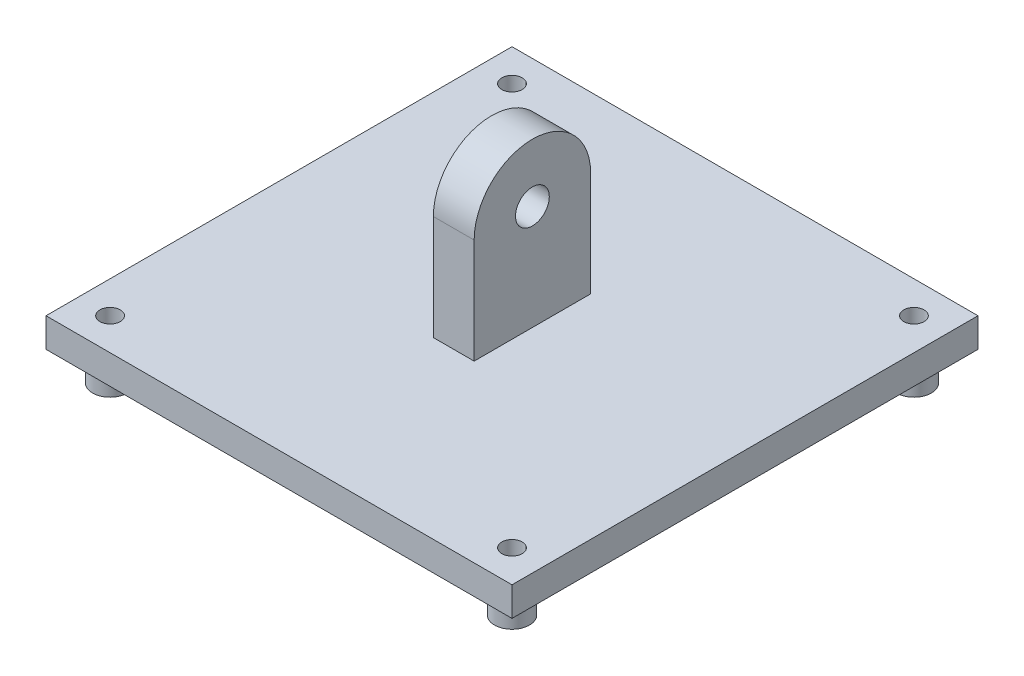
ISO-10303-21;
HEADER;
FILE_DESCRIPTION(('STEP AP214'),'2;1');
FILE_NAME('part.step','',(''),(''),'','','');
FILE_SCHEMA(('AUTOMOTIVE_DESIGN { 1 0 10303 214 1 1 1 1 }'));
ENDSEC;
DATA;
#1=APPLICATION_CONTEXT('core data for automotive mechanical design processes');
#2=APPLICATION_PROTOCOL_DEFINITION('international standard','automotive_design',2000,#1);
#3=PRODUCT_CONTEXT('',#1,'mechanical');
#4=PRODUCT('Part','Part','',(#3));
#5=PRODUCT_RELATED_PRODUCT_CATEGORY('part','',(#4));
#6=PRODUCT_DEFINITION_FORMATION('','',#4);
#7=PRODUCT_DEFINITION_CONTEXT('part definition',#1,'design');
#8=PRODUCT_DEFINITION('design','',#6,#7);
#9=PRODUCT_DEFINITION_SHAPE('','',#8);
#10=(LENGTH_UNIT() NAMED_UNIT(*) SI_UNIT(.MILLI.,.METRE.));
#11=(NAMED_UNIT(*) PLANE_ANGLE_UNIT() SI_UNIT($,.RADIAN.));
#12=(NAMED_UNIT(*) SI_UNIT($,.STERADIAN.) SOLID_ANGLE_UNIT());
#13=UNCERTAINTY_MEASURE_WITH_UNIT(LENGTH_MEASURE(1.E-05),#10,'distance_accuracy_value','');
#14=(GEOMETRIC_REPRESENTATION_CONTEXT(3) GLOBAL_UNCERTAINTY_ASSIGNED_CONTEXT((#13)) GLOBAL_UNIT_ASSIGNED_CONTEXT((#10,
#11,#12)) REPRESENTATION_CONTEXT('',''));
#15=CARTESIAN_POINT('',(0.,0.,0.));
#16=DIRECTION('',(0.,0.,1.));
#17=DIRECTION('',(1.,0.,0.));
#18=AXIS2_PLACEMENT_3D('',#15,#16,#17);
#19=CARTESIAN_POINT('',(40.,5.,40.));
#20=DIRECTION('',(-1.,0.,0.));
#21=DIRECTION('',(0.,0.,1.));
#22=AXIS2_PLACEMENT_3D('',#19,#20,#21);
#23=PLANE('',#22);
#24=DIRECTION('',(0.,-1.,0.));
#25=VECTOR('',#24,1.);
#26=CARTESIAN_POINT('',(40.,5.,-40.));
#27=LINE('',#26,#25);
#28=CARTESIAN_POINT('',(40.,5.,-40.));
#29=VERTEX_POINT('',#28);
#30=CARTESIAN_POINT('',(40.,0.,-40.));
#31=VERTEX_POINT('',#30);
#32=EDGE_CURVE('E11',#29,#31,#27,.T.);
#33=ORIENTED_EDGE('',*,*,#32,.F.);
#34=DIRECTION('',(0.,0.,-1.));
#35=VECTOR('',#34,1.);
#36=CARTESIAN_POINT('',(40.,5.,40.));
#37=LINE('',#36,#35);
#38=CARTESIAN_POINT('',(40.,5.,40.));
#39=VERTEX_POINT('',#38);
#40=EDGE_CURVE('E218',#39,#29,#37,.T.);
#41=ORIENTED_EDGE('',*,*,#40,.F.);
#42=DIRECTION('',(0.,-1.,0.));
#43=VECTOR('',#42,1.);
#44=CARTESIAN_POINT('',(40.,5.,40.));
#45=LINE('',#44,#43);
#46=CARTESIAN_POINT('',(40.,0.,40.));
#47=VERTEX_POINT('',#46);
#48=EDGE_CURVE('E231',#39,#47,#45,.T.);
#49=ORIENTED_EDGE('',*,*,#48,.T.);
#50=DIRECTION('',(0.,0.,-1.));
#51=VECTOR('',#50,1.);
#52=CARTESIAN_POINT('',(40.,0.,40.));
#53=LINE('',#52,#51);
#54=EDGE_CURVE('E214',#47,#31,#53,.T.);
#55=ORIENTED_EDGE('',*,*,#54,.T.);
#56=EDGE_LOOP('',(#33,#41,#49,#55));
#57=FACE_BOUND('',#56,.T.);
#58=ADVANCED_FACE('F47',(#57),#23,.F.);
#59=CARTESIAN_POINT('',(-40.,5.,40.));
#60=DIRECTION('',(1.,0.,0.));
#61=DIRECTION('',(0.,0.,-1.));
#62=AXIS2_PLACEMENT_3D('',#59,#60,#61);
#63=PLANE('',#62);
#64=DIRECTION('',(0.,-1.,0.));
#65=VECTOR('',#64,1.);
#66=CARTESIAN_POINT('',(-40.,5.,40.));
#67=LINE('',#66,#65);
#68=CARTESIAN_POINT('',(-40.,5.,40.));
#69=VERTEX_POINT('',#68);
#70=CARTESIAN_POINT('',(-40.,0.,40.));
#71=VERTEX_POINT('',#70);
#72=EDGE_CURVE('E246',#69,#71,#67,.T.);
#73=ORIENTED_EDGE('',*,*,#72,.F.);
#74=DIRECTION('',(0.,0.,1.));
#75=VECTOR('',#74,1.);
#76=CARTESIAN_POINT('',(-40.,5.,40.));
#77=LINE('',#76,#75);
#78=CARTESIAN_POINT('',(-40.,5.,-40.));
#79=VERTEX_POINT('',#78);
#80=EDGE_CURVE('E225',#79,#69,#77,.T.);
#81=ORIENTED_EDGE('',*,*,#80,.F.);
#82=DIRECTION('',(0.,-1.,0.));
#83=VECTOR('',#82,1.);
#84=CARTESIAN_POINT('',(-40.,5.,-40.));
#85=LINE('',#84,#83);
#86=CARTESIAN_POINT('',(-40.,0.,-40.));
#87=VERTEX_POINT('',#86);
#88=EDGE_CURVE('E56',#79,#87,#85,.T.);
#89=ORIENTED_EDGE('',*,*,#88,.T.);
#90=DIRECTION('',(0.,0.,1.));
#91=VECTOR('',#90,1.);
#92=CARTESIAN_POINT('',(-40.,0.,40.));
#93=LINE('',#92,#91);
#94=EDGE_CURVE('E238',#87,#71,#93,.T.);
#95=ORIENTED_EDGE('',*,*,#94,.T.);
#96=EDGE_LOOP('',(#73,#81,#89,#95));
#97=FACE_BOUND('',#96,.T.);
#98=ADVANCED_FACE('F299',(#97),#63,.F.);
#99=CARTESIAN_POINT('',(-40.,5.,-40.));
#100=DIRECTION('',(0.,0.,1.));
#101=DIRECTION('',(1.,0.,0.));
#102=AXIS2_PLACEMENT_3D('',#99,#100,#101);
#103=PLANE('',#102);
#104=DIRECTION('',(-1.,0.,0.));
#105=VECTOR('',#104,1.);
#106=CARTESIAN_POINT('',(-40.,0.,-40.));
#107=LINE('',#106,#105);
#108=EDGE_CURVE('E235',#31,#87,#107,.T.);
#109=ORIENTED_EDGE('',*,*,#108,.T.);
#110=ORIENTED_EDGE('',*,*,#88,.F.);
#111=DIRECTION('',(-1.,0.,0.));
#112=VECTOR('',#111,1.);
#113=CARTESIAN_POINT('',(-40.,5.,-40.));
#114=LINE('',#113,#112);
#115=EDGE_CURVE('E221',#29,#79,#114,.T.);
#116=ORIENTED_EDGE('',*,*,#115,.F.);
#117=ORIENTED_EDGE('',*,*,#32,.T.);
#118=EDGE_LOOP('',(#109,#110,#116,#117));
#119=FACE_BOUND('',#118,.T.);
#120=ADVANCED_FACE('F305',(#119),#103,.F.);
#121=CARTESIAN_POINT('',(-40.,5.,40.));
#122=DIRECTION('',(0.,0.,-1.));
#123=DIRECTION('',(-1.,0.,0.));
#124=AXIS2_PLACEMENT_3D('',#121,#122,#123);
#125=PLANE('',#124);
#126=DIRECTION('',(1.,0.,0.));
#127=VECTOR('',#126,1.);
#128=CARTESIAN_POINT('',(-40.,0.,40.));
#129=LINE('',#128,#127);
#130=EDGE_CURVE('E222',#71,#47,#129,.T.);
#131=ORIENTED_EDGE('',*,*,#130,.T.);
#132=ORIENTED_EDGE('',*,*,#48,.F.);
#133=DIRECTION('',(1.,0.,0.));
#134=VECTOR('',#133,1.);
#135=CARTESIAN_POINT('',(-40.,5.,40.));
#136=LINE('',#135,#134);
#137=EDGE_CURVE('E228',#69,#39,#136,.T.);
#138=ORIENTED_EDGE('',*,*,#137,.F.);
#139=ORIENTED_EDGE('',*,*,#72,.T.);
#140=EDGE_LOOP('',(#131,#132,#138,#139));
#141=FACE_BOUND('',#140,.T.);
#142=ADVANCED_FACE('F321',(#141),#125,.F.);
#143=CARTESIAN_POINT('',(0.,5.,0.));
#144=DIRECTION('',(0.,-1.,0.));
#145=DIRECTION('',(0.,0.,-1.));
#146=AXIS2_PLACEMENT_3D('',#143,#144,#145);
#147=PLANE('',#146);
#148=DIRECTION('',(0.,0.,1.));
#149=VECTOR('',#148,1.);
#150=CARTESIAN_POINT('',(-3.5,5.,-10.));
#151=LINE('',#150,#149);
#152=CARTESIAN_POINT('',(-3.5,5.,-10.));
#153=VERTEX_POINT('',#152);
#154=CARTESIAN_POINT('',(-3.5,5.,10.));
#155=VERTEX_POINT('',#154);
#156=EDGE_CURVE('E72',#153,#155,#151,.T.);
#157=ORIENTED_EDGE('',*,*,#156,.F.);
#158=DIRECTION('',(1.,0.,0.));
#159=VECTOR('',#158,1.);
#160=CARTESIAN_POINT('',(-74.4093010681705,5.,-10.));
#161=LINE('',#160,#159);
#162=CARTESIAN_POINT('',(3.5,5.,-10.));
#163=VERTEX_POINT('',#162);
#164=EDGE_CURVE('E132',#153,#163,#161,.T.);
#165=ORIENTED_EDGE('',*,*,#164,.T.);
#166=DIRECTION('',(0.,0.,-1.));
#167=VECTOR('',#166,1.);
#168=CARTESIAN_POINT('',(3.5,5.,10.));
#169=LINE('',#168,#167);
#170=CARTESIAN_POINT('',(3.5,5.,10.));
#171=VERTEX_POINT('',#170);
#172=EDGE_CURVE('E115',#171,#163,#169,.T.);
#173=ORIENTED_EDGE('',*,*,#172,.F.);
#174=DIRECTION('',(1.,0.,0.));
#175=VECTOR('',#174,1.);
#176=CARTESIAN_POINT('',(-74.4093010681705,5.,10.));
#177=LINE('',#176,#175);
#178=EDGE_CURVE('E130',#155,#171,#177,.T.);
#179=ORIENTED_EDGE('',*,*,#178,.F.);
#180=EDGE_LOOP('',(#157,#165,#173,#179));
#181=FACE_BOUND('',#180,.T.);
#182=CARTESIAN_POINT('',(34.5,5.,-34.5));
#183=DIRECTION('',(0.,-1.,0.));
#184=DIRECTION('',(0.,0.,-1.));
#185=AXIS2_PLACEMENT_3D('',#182,#183,#184);
#186=CIRCLE('',#185,1.75);
#187=CARTESIAN_POINT('',(34.5,5.,-36.25));
#188=VERTEX_POINT('',#187);
#189=EDGE_CURVE('E138',#188,#188,#186,.T.);
#190=ORIENTED_EDGE('',*,*,#189,.T.);
#191=EDGE_LOOP('',(#190));
#192=FACE_BOUND('',#191,.T.);
#193=CARTESIAN_POINT('',(-34.5,5.,-34.5));
#194=DIRECTION('',(0.,-1.,0.));
#195=DIRECTION('',(0.,0.,-1.));
#196=AXIS2_PLACEMENT_3D('',#193,#194,#195);
#197=CIRCLE('',#196,1.75);
#198=CARTESIAN_POINT('',(-34.5,5.,-36.25));
#199=VERTEX_POINT('',#198);
#200=EDGE_CURVE('E178',#199,#199,#197,.T.);
#201=ORIENTED_EDGE('',*,*,#200,.T.);
#202=EDGE_LOOP('',(#201));
#203=FACE_BOUND('',#202,.T.);
#204=ORIENTED_EDGE('',*,*,#80,.T.);
#205=ORIENTED_EDGE('',*,*,#137,.T.);
#206=ORIENTED_EDGE('',*,*,#40,.T.);
#207=ORIENTED_EDGE('',*,*,#115,.T.);
#208=EDGE_LOOP('',(#204,#205,#206,#207));
#209=FACE_BOUND('',#208,.T.);
#210=CARTESIAN_POINT('',(-34.5,5.,34.5));
#211=DIRECTION('',(0.,-1.,0.));
#212=DIRECTION('',(0.,0.,-1.));
#213=AXIS2_PLACEMENT_3D('',#210,#211,#212);
#214=CIRCLE('',#213,1.75);
#215=CARTESIAN_POINT('',(-34.5,5.,32.75));
#216=VERTEX_POINT('',#215);
#217=EDGE_CURVE('E163',#216,#216,#214,.T.);
#218=ORIENTED_EDGE('',*,*,#217,.T.);
#219=EDGE_LOOP('',(#218));
#220=FACE_BOUND('',#219,.T.);
#221=CARTESIAN_POINT('',(34.5,5.,34.5));
#222=DIRECTION('',(0.,-1.,0.));
#223=DIRECTION('',(0.,0.,-1.));
#224=AXIS2_PLACEMENT_3D('',#221,#222,#223);
#225=CIRCLE('',#224,1.75);
#226=CARTESIAN_POINT('',(34.5,5.,32.75));
#227=VERTEX_POINT('',#226);
#228=EDGE_CURVE('E171',#227,#227,#225,.T.);
#229=ORIENTED_EDGE('',*,*,#228,.T.);
#230=EDGE_LOOP('',(#229));
#231=FACE_BOUND('',#230,.T.);
#232=ADVANCED_FACE('F128',(#181,#192,#203,#209,#220,#231),#147,.F.);
#233=CARTESIAN_POINT('',(0.,0.,0.));
#234=DIRECTION('',(0.,-1.,0.));
#235=DIRECTION('',(0.,0.,-1.));
#236=AXIS2_PLACEMENT_3D('',#233,#234,#235);
#237=PLANE('',#236);
#238=CARTESIAN_POINT('',(-34.5,0.,-34.5));
#239=DIRECTION('',(0.,-1.,0.));
#240=DIRECTION('',(0.,0.,-1.));
#241=AXIS2_PLACEMENT_3D('',#238,#239,#240);
#242=CIRCLE('',#241,3.);
#243=CARTESIAN_POINT('',(-34.5,0.,-37.5));
#244=VERTEX_POINT('',#243);
#245=EDGE_CURVE('E203',#244,#244,#242,.T.);
#246=ORIENTED_EDGE('',*,*,#245,.F.);
#247=EDGE_LOOP('',(#246));
#248=FACE_BOUND('',#247,.T.);
#249=CARTESIAN_POINT('',(34.5,0.,-34.5));
#250=DIRECTION('',(0.,-1.,0.));
#251=DIRECTION('',(0.,0.,-1.));
#252=AXIS2_PLACEMENT_3D('',#249,#250,#251);
#253=CIRCLE('',#252,3.);
#254=CARTESIAN_POINT('',(34.5,0.,-37.5));
#255=VERTEX_POINT('',#254);
#256=EDGE_CURVE('E195',#255,#255,#253,.T.);
#257=ORIENTED_EDGE('',*,*,#256,.F.);
#258=EDGE_LOOP('',(#257));
#259=FACE_BOUND('',#258,.T.);
#260=CARTESIAN_POINT('',(34.5,0.,34.5));
#261=DIRECTION('',(0.,-1.,0.));
#262=DIRECTION('',(0.,0.,-1.));
#263=AXIS2_PLACEMENT_3D('',#260,#261,#262);
#264=CIRCLE('',#263,3.);
#265=CARTESIAN_POINT('',(34.5,0.,31.5));
#266=VERTEX_POINT('',#265);
#267=EDGE_CURVE('E186',#266,#266,#264,.T.);
#268=ORIENTED_EDGE('',*,*,#267,.F.);
#269=EDGE_LOOP('',(#268));
#270=FACE_BOUND('',#269,.T.);
#271=CARTESIAN_POINT('',(-34.5,0.,34.5));
#272=DIRECTION('',(0.,-1.,0.));
#273=DIRECTION('',(0.,0.,-1.));
#274=AXIS2_PLACEMENT_3D('',#271,#272,#273);
#275=CIRCLE('',#274,3.);
#276=CARTESIAN_POINT('',(-34.5,0.,31.5));
#277=VERTEX_POINT('',#276);
#278=EDGE_CURVE('E190',#277,#277,#275,.T.);
#279=ORIENTED_EDGE('',*,*,#278,.F.);
#280=EDGE_LOOP('',(#279));
#281=FACE_BOUND('',#280,.T.);
#282=ORIENTED_EDGE('',*,*,#54,.F.);
#283=ORIENTED_EDGE('',*,*,#130,.F.);
#284=ORIENTED_EDGE('',*,*,#94,.F.);
#285=ORIENTED_EDGE('',*,*,#108,.F.);
#286=EDGE_LOOP('',(#282,#283,#284,#285));
#287=FACE_BOUND('',#286,.T.);
#288=ADVANCED_FACE('F324',(#248,#259,#270,#281,#287),#237,.T.);
#289=CARTESIAN_POINT('',(-34.5,-5.,34.5));
#290=DIRECTION('',(0.,1.,0.));
#291=DIRECTION('',(0.,0.,1.));
#292=AXIS2_PLACEMENT_3D('',#289,#290,#291);
#293=CYLINDRICAL_SURFACE('',#292,3.);
#294=CARTESIAN_POINT('',(-34.5,-5.,34.5));
#295=DIRECTION('',(0.,-1.,0.));
#296=DIRECTION('',(0.,0.,-1.));
#297=AXIS2_PLACEMENT_3D('',#294,#295,#296);
#298=CIRCLE('',#297,3.);
#299=CARTESIAN_POINT('',(-34.5,-5.,31.5));
#300=VERTEX_POINT('',#299);
#301=EDGE_CURVE('E210',#300,#300,#298,.T.);
#302=ORIENTED_EDGE('',*,*,#301,.F.);
#303=EDGE_LOOP('',(#302));
#304=FACE_BOUND('',#303,.T.);
#305=ORIENTED_EDGE('',*,*,#278,.T.);
#306=EDGE_LOOP('',(#305));
#307=FACE_BOUND('',#306,.T.);
#308=ADVANCED_FACE('F327',(#304,#307),#293,.T.);
#309=CARTESIAN_POINT('',(-34.5,-5.,34.5));
#310=DIRECTION('',(0.,-1.,0.));
#311=DIRECTION('',(0.,0.,-1.));
#312=AXIS2_PLACEMENT_3D('',#309,#310,#311);
#313=PLANE('',#312);
#314=CARTESIAN_POINT('',(-34.5,-5.,34.5));
#315=DIRECTION('',(0.,-1.,0.));
#316=DIRECTION('',(0.,0.,-1.));
#317=AXIS2_PLACEMENT_3D('',#314,#315,#316);
#318=CIRCLE('',#317,1.75);
#319=CARTESIAN_POINT('',(-34.5,-5.,32.75));
#320=VERTEX_POINT('',#319);
#321=EDGE_CURVE('E158',#320,#320,#318,.T.);
#322=ORIENTED_EDGE('',*,*,#321,.F.);
#323=EDGE_LOOP('',(#322));
#324=FACE_BOUND('',#323,.T.);
#325=ORIENTED_EDGE('',*,*,#301,.T.);
#326=EDGE_LOOP('',(#325));
#327=FACE_BOUND('',#326,.T.);
#328=ADVANCED_FACE('F334',(#324,#327),#313,.T.);
#329=CARTESIAN_POINT('',(34.5,-5.,34.5));
#330=DIRECTION('',(0.,1.,0.));
#331=DIRECTION('',(0.,0.,1.));
#332=AXIS2_PLACEMENT_3D('',#329,#330,#331);
#333=CYLINDRICAL_SURFACE('',#332,3.);
#334=CARTESIAN_POINT('',(34.5,-5.,34.5));
#335=DIRECTION('',(0.,-1.,0.));
#336=DIRECTION('',(0.,0.,-1.));
#337=AXIS2_PLACEMENT_3D('',#334,#335,#336);
#338=CIRCLE('',#337,3.);
#339=CARTESIAN_POINT('',(34.5,-5.,31.5));
#340=VERTEX_POINT('',#339);
#341=EDGE_CURVE('E191',#340,#340,#338,.T.);
#342=ORIENTED_EDGE('',*,*,#341,.F.);
#343=EDGE_LOOP('',(#342));
#344=FACE_BOUND('',#343,.T.);
#345=ORIENTED_EDGE('',*,*,#267,.T.);
#346=EDGE_LOOP('',(#345));
#347=FACE_BOUND('',#346,.T.);
#348=ADVANCED_FACE('F381',(#344,#347),#333,.T.);
#349=CARTESIAN_POINT('',(34.5,-5.,34.5));
#350=DIRECTION('',(0.,-1.,0.));
#351=DIRECTION('',(0.,0.,-1.));
#352=AXIS2_PLACEMENT_3D('',#349,#350,#351);
#353=PLANE('',#352);
#354=CARTESIAN_POINT('',(34.5,-5.,34.5));
#355=DIRECTION('',(0.,-1.,0.));
#356=DIRECTION('',(0.,0.,-1.));
#357=AXIS2_PLACEMENT_3D('',#354,#355,#356);
#358=CIRCLE('',#357,1.75);
#359=CARTESIAN_POINT('',(34.5,-5.,32.75));
#360=VERTEX_POINT('',#359);
#361=EDGE_CURVE('E167',#360,#360,#358,.T.);
#362=ORIENTED_EDGE('',*,*,#361,.F.);
#363=EDGE_LOOP('',(#362));
#364=FACE_BOUND('',#363,.T.);
#365=ORIENTED_EDGE('',*,*,#341,.T.);
#366=EDGE_LOOP('',(#365));
#367=FACE_BOUND('',#366,.T.);
#368=ADVANCED_FACE('F392',(#364,#367),#353,.T.);
#369=CARTESIAN_POINT('',(34.5,-5.,-34.5));
#370=DIRECTION('',(0.,1.,0.));
#371=DIRECTION('',(0.,0.,1.));
#372=AXIS2_PLACEMENT_3D('',#369,#370,#371);
#373=CYLINDRICAL_SURFACE('',#372,3.);
#374=CARTESIAN_POINT('',(34.5,-5.,-34.5));
#375=DIRECTION('',(0.,-1.,0.));
#376=DIRECTION('',(0.,0.,-1.));
#377=AXIS2_PLACEMENT_3D('',#374,#375,#376);
#378=CIRCLE('',#377,3.);
#379=CARTESIAN_POINT('',(34.5,-5.,-37.5));
#380=VERTEX_POINT('',#379);
#381=EDGE_CURVE('E199',#380,#380,#378,.T.);
#382=ORIENTED_EDGE('',*,*,#381,.F.);
#383=EDGE_LOOP('',(#382));
#384=FACE_BOUND('',#383,.T.);
#385=ORIENTED_EDGE('',*,*,#256,.T.);
#386=EDGE_LOOP('',(#385));
#387=FACE_BOUND('',#386,.T.);
#388=ADVANCED_FACE('F402',(#384,#387),#373,.T.);
#389=CARTESIAN_POINT('',(34.5,-5.,-34.5));
#390=DIRECTION('',(0.,-1.,0.));
#391=DIRECTION('',(0.,0.,-1.));
#392=AXIS2_PLACEMENT_3D('',#389,#390,#391);
#393=PLANE('',#392);
#394=CARTESIAN_POINT('',(34.5,-5.,-34.5));
#395=DIRECTION('',(0.,-1.,0.));
#396=DIRECTION('',(0.,0.,-1.));
#397=AXIS2_PLACEMENT_3D('',#394,#395,#396);
#398=CIRCLE('',#397,1.75);
#399=CARTESIAN_POINT('',(34.5,-5.,-36.25));
#400=VERTEX_POINT('',#399);
#401=EDGE_CURVE('E145',#400,#400,#398,.T.);
#402=ORIENTED_EDGE('',*,*,#401,.F.);
#403=EDGE_LOOP('',(#402));
#404=FACE_BOUND('',#403,.T.);
#405=ORIENTED_EDGE('',*,*,#381,.T.);
#406=EDGE_LOOP('',(#405));
#407=FACE_BOUND('',#406,.T.);
#408=ADVANCED_FACE('F412',(#404,#407),#393,.T.);
#409=CARTESIAN_POINT('',(-34.5,-5.,-34.5));
#410=DIRECTION('',(0.,1.,0.));
#411=DIRECTION('',(0.,0.,1.));
#412=AXIS2_PLACEMENT_3D('',#409,#410,#411);
#413=CYLINDRICAL_SURFACE('',#412,3.);
#414=CARTESIAN_POINT('',(-34.5,-5.,-34.5));
#415=DIRECTION('',(0.,-1.,0.));
#416=DIRECTION('',(0.,0.,-1.));
#417=AXIS2_PLACEMENT_3D('',#414,#415,#416);
#418=CIRCLE('',#417,3.);
#419=CARTESIAN_POINT('',(-34.5,-5.,-37.5));
#420=VERTEX_POINT('',#419);
#421=EDGE_CURVE('E182',#420,#420,#418,.T.);
#422=ORIENTED_EDGE('',*,*,#421,.F.);
#423=EDGE_LOOP('',(#422));
#424=FACE_BOUND('',#423,.T.);
#425=ORIENTED_EDGE('',*,*,#245,.T.);
#426=EDGE_LOOP('',(#425));
#427=FACE_BOUND('',#426,.T.);
#428=ADVANCED_FACE('F421',(#424,#427),#413,.T.);
#429=CARTESIAN_POINT('',(-34.5,-5.,-34.5));
#430=DIRECTION('',(0.,-1.,0.));
#431=DIRECTION('',(0.,0.,-1.));
#432=AXIS2_PLACEMENT_3D('',#429,#430,#431);
#433=PLANE('',#432);
#434=CARTESIAN_POINT('',(-34.5,-5.,-34.5));
#435=DIRECTION('',(0.,-1.,0.));
#436=DIRECTION('',(0.,0.,-1.));
#437=AXIS2_PLACEMENT_3D('',#434,#435,#436);
#438=CIRCLE('',#437,1.75);
#439=CARTESIAN_POINT('',(-34.5,-5.,-36.25));
#440=VERTEX_POINT('',#439);
#441=EDGE_CURVE('E162',#440,#440,#438,.T.);
#442=ORIENTED_EDGE('',*,*,#441,.F.);
#443=EDGE_LOOP('',(#442));
#444=FACE_BOUND('',#443,.T.);
#445=ORIENTED_EDGE('',*,*,#421,.T.);
#446=EDGE_LOOP('',(#445));
#447=FACE_BOUND('',#446,.T.);
#448=ADVANCED_FACE('F431',(#444,#447),#433,.T.);
#449=CARTESIAN_POINT('',(-34.5,5.,-34.5));
#450=DIRECTION('',(0.,-1.,0.));
#451=DIRECTION('',(0.,0.,-1.));
#452=AXIS2_PLACEMENT_3D('',#449,#450,#451);
#453=CYLINDRICAL_SURFACE('',#452,1.75);
#454=ORIENTED_EDGE('',*,*,#200,.F.);
#455=EDGE_LOOP('',(#454));
#456=FACE_BOUND('',#455,.T.);
#457=ORIENTED_EDGE('',*,*,#441,.T.);
#458=EDGE_LOOP('',(#457));
#459=FACE_BOUND('',#458,.T.);
#460=ADVANCED_FACE('F440',(#456,#459),#453,.F.);
#461=CARTESIAN_POINT('',(34.5,5.,-34.5));
#462=DIRECTION('',(0.,-1.,0.));
#463=DIRECTION('',(0.,0.,-1.));
#464=AXIS2_PLACEMENT_3D('',#461,#462,#463);
#465=CYLINDRICAL_SURFACE('',#464,1.75);
#466=ORIENTED_EDGE('',*,*,#189,.F.);
#467=EDGE_LOOP('',(#466));
#468=FACE_BOUND('',#467,.T.);
#469=ORIENTED_EDGE('',*,*,#401,.T.);
#470=EDGE_LOOP('',(#469));
#471=FACE_BOUND('',#470,.T.);
#472=ADVANCED_FACE('F450',(#468,#471),#465,.F.);
#473=CARTESIAN_POINT('',(34.5,5.,34.5));
#474=DIRECTION('',(0.,-1.,0.));
#475=DIRECTION('',(0.,0.,-1.));
#476=AXIS2_PLACEMENT_3D('',#473,#474,#475);
#477=CYLINDRICAL_SURFACE('',#476,1.75);
#478=ORIENTED_EDGE('',*,*,#228,.F.);
#479=EDGE_LOOP('',(#478));
#480=FACE_BOUND('',#479,.T.);
#481=ORIENTED_EDGE('',*,*,#361,.T.);
#482=EDGE_LOOP('',(#481));
#483=FACE_BOUND('',#482,.T.);
#484=ADVANCED_FACE('F460',(#480,#483),#477,.F.);
#485=CARTESIAN_POINT('',(-34.5,5.,34.5));
#486=DIRECTION('',(0.,-1.,0.));
#487=DIRECTION('',(0.,0.,-1.));
#488=AXIS2_PLACEMENT_3D('',#485,#486,#487);
#489=CYLINDRICAL_SURFACE('',#488,1.75);
#490=ORIENTED_EDGE('',*,*,#217,.F.);
#491=EDGE_LOOP('',(#490));
#492=FACE_BOUND('',#491,.T.);
#493=ORIENTED_EDGE('',*,*,#321,.T.);
#494=EDGE_LOOP('',(#493));
#495=FACE_BOUND('',#494,.T.);
#496=ADVANCED_FACE('F470',(#492,#495),#489,.F.);
#497=CARTESIAN_POINT('',(-74.4093010681705,5.,-10.));
#498=DIRECTION('',(0.,0.,-1.));
#499=DIRECTION('',(-1.,0.,0.));
#500=AXIS2_PLACEMENT_3D('',#497,#498,#499);
#501=PLANE('',#500);
#502=DIRECTION('',(0.,-1.,0.));
#503=VECTOR('',#502,1.);
#504=CARTESIAN_POINT('',(-3.5,33.,-10.));
#505=LINE('',#504,#503);
#506=CARTESIAN_POINT('',(-3.5,23.,-10.));
#507=VERTEX_POINT('',#506);
#508=EDGE_CURVE('E134',#507,#153,#505,.T.);
#509=ORIENTED_EDGE('',*,*,#508,.F.);
#510=DIRECTION('',(1.,0.,0.));
#511=VECTOR('',#510,1.);
#512=CARTESIAN_POINT('',(-74.4093010681705,23.,-10.));
#513=LINE('',#512,#511);
#514=CARTESIAN_POINT('',(3.5,23.,-10.));
#515=VERTEX_POINT('',#514);
#516=EDGE_CURVE('E147',#507,#515,#513,.T.);
#517=ORIENTED_EDGE('',*,*,#516,.T.);
#518=DIRECTION('',(0.,-1.,0.));
#519=VECTOR('',#518,1.);
#520=CARTESIAN_POINT('',(3.5,33.,-10.));
#521=LINE('',#520,#519);
#522=EDGE_CURVE('E123',#515,#163,#521,.T.);
#523=ORIENTED_EDGE('',*,*,#522,.T.);
#524=ORIENTED_EDGE('',*,*,#164,.F.);
#525=EDGE_LOOP('',(#509,#517,#523,#524));
#526=FACE_BOUND('',#525,.T.);
#527=ADVANCED_FACE('F279',(#526),#501,.T.);
#528=CARTESIAN_POINT('',(-74.4093010681705,23.,0.));
#529=DIRECTION('',(1.,0.,0.));
#530=DIRECTION('',(0.,0.,-1.));
#531=AXIS2_PLACEMENT_3D('',#528,#529,#530);
#532=CYLINDRICAL_SURFACE('',#531,10.);
#533=CARTESIAN_POINT('',(-3.5,23.,0.));
#534=DIRECTION('',(1.,0.,0.));
#535=DIRECTION('',(0.,0.,-1.));
#536=AXIS2_PLACEMENT_3D('',#533,#534,#535);
#537=CIRCLE('',#536,10.);
#538=CARTESIAN_POINT('',(-3.5,23.,10.));
#539=VERTEX_POINT('',#538);
#540=EDGE_CURVE('E150',#539,#507,#537,.F.);
#541=ORIENTED_EDGE('',*,*,#540,.F.);
#542=DIRECTION('',(1.,0.,0.));
#543=VECTOR('',#542,1.);
#544=CARTESIAN_POINT('',(-74.4093010681705,23.,10.));
#545=LINE('',#544,#543);
#546=CARTESIAN_POINT('',(3.5,23.,10.));
#547=VERTEX_POINT('',#546);
#548=EDGE_CURVE('E139',#539,#547,#545,.T.);
#549=ORIENTED_EDGE('',*,*,#548,.T.);
#550=CARTESIAN_POINT('',(3.5,23.,0.));
#551=DIRECTION('',(-1.,0.,0.));
#552=DIRECTION('',(0.,0.,1.));
#553=AXIS2_PLACEMENT_3D('',#550,#551,#552);
#554=CIRCLE('',#553,10.);
#555=EDGE_CURVE('E64',#515,#547,#554,.F.);
#556=ORIENTED_EDGE('',*,*,#555,.F.);
#557=ORIENTED_EDGE('',*,*,#516,.F.);
#558=EDGE_LOOP('',(#541,#549,#556,#557));
#559=FACE_BOUND('',#558,.T.);
#560=ADVANCED_FACE('F281',(#559),#532,.T.);
#561=CARTESIAN_POINT('',(-74.4093010681705,5.,10.));
#562=DIRECTION('',(0.,0.,1.));
#563=DIRECTION('',(1.,0.,0.));
#564=AXIS2_PLACEMENT_3D('',#561,#562,#563);
#565=PLANE('',#564);
#566=DIRECTION('',(0.,-1.,0.));
#567=VECTOR('',#566,1.);
#568=CARTESIAN_POINT('',(-3.5,33.,10.));
#569=LINE('',#568,#567);
#570=EDGE_CURVE('E122',#539,#155,#569,.T.);
#571=ORIENTED_EDGE('',*,*,#570,.T.);
#572=ORIENTED_EDGE('',*,*,#178,.T.);
#573=DIRECTION('',(0.,-1.,0.));
#574=VECTOR('',#573,1.);
#575=CARTESIAN_POINT('',(3.5,33.,10.));
#576=LINE('',#575,#574);
#577=EDGE_CURVE('E111',#547,#171,#576,.T.);
#578=ORIENTED_EDGE('',*,*,#577,.F.);
#579=ORIENTED_EDGE('',*,*,#548,.F.);
#580=EDGE_LOOP('',(#571,#572,#578,#579));
#581=FACE_BOUND('',#580,.T.);
#582=ADVANCED_FACE('F136',(#581),#565,.T.);
#583=CARTESIAN_POINT('',(3.5,33.,10.));
#584=DIRECTION('',(-1.,0.,0.));
#585=DIRECTION('',(0.,0.,1.));
#586=AXIS2_PLACEMENT_3D('',#583,#584,#585);
#587=PLANE('',#586);
#588=ORIENTED_EDGE('',*,*,#555,.T.);
#589=ORIENTED_EDGE('',*,*,#577,.T.);
#590=ORIENTED_EDGE('',*,*,#172,.T.);
#591=ORIENTED_EDGE('',*,*,#522,.F.);
#592=EDGE_LOOP('',(#588,#589,#590,#591));
#593=FACE_BOUND('',#592,.T.);
#594=CARTESIAN_POINT('',(3.5,23.,0.));
#595=DIRECTION('',(-1.,0.,0.));
#596=DIRECTION('',(0.,0.,1.));
#597=AXIS2_PLACEMENT_3D('',#594,#595,#596);
#598=CIRCLE('',#597,2.9);
#599=CARTESIAN_POINT('',(3.5,23.,2.9));
#600=VERTEX_POINT('',#599);
#601=EDGE_CURVE('E252',#600,#600,#598,.F.);
#602=ORIENTED_EDGE('',*,*,#601,.F.);
#603=EDGE_LOOP('',(#602));
#604=FACE_BOUND('',#603,.T.);
#605=ADVANCED_FACE('F113',(#593,#604),#587,.F.);
#606=CARTESIAN_POINT('',(-3.5,33.,-10.));
#607=DIRECTION('',(1.,0.,0.));
#608=DIRECTION('',(0.,0.,-1.));
#609=AXIS2_PLACEMENT_3D('',#606,#607,#608);
#610=PLANE('',#609);
#611=ORIENTED_EDGE('',*,*,#540,.T.);
#612=ORIENTED_EDGE('',*,*,#508,.T.);
#613=ORIENTED_EDGE('',*,*,#156,.T.);
#614=ORIENTED_EDGE('',*,*,#570,.F.);
#615=EDGE_LOOP('',(#611,#612,#613,#614));
#616=FACE_BOUND('',#615,.T.);
#617=CARTESIAN_POINT('',(-3.5,23.,0.));
#618=DIRECTION('',(1.,0.,0.));
#619=DIRECTION('',(0.,0.,-1.));
#620=AXIS2_PLACEMENT_3D('',#617,#618,#619);
#621=CIRCLE('',#620,2.9);
#622=CARTESIAN_POINT('',(-3.5,23.,-2.9));
#623=VERTEX_POINT('',#622);
#624=EDGE_CURVE('E50',#623,#623,#621,.F.);
#625=ORIENTED_EDGE('',*,*,#624,.F.);
#626=EDGE_LOOP('',(#625));
#627=FACE_BOUND('',#626,.T.);
#628=ADVANCED_FACE('F274',(#616,#627),#610,.F.);
#629=CARTESIAN_POINT('',(-74.4093010681705,23.,0.));
#630=DIRECTION('',(1.,0.,0.));
#631=DIRECTION('',(0.,0.,-1.));
#632=AXIS2_PLACEMENT_3D('',#629,#630,#631);
#633=CYLINDRICAL_SURFACE('',#632,2.9);
#634=ORIENTED_EDGE('',*,*,#624,.T.);
#635=EDGE_LOOP('',(#634));
#636=FACE_BOUND('',#635,.T.);
#637=ORIENTED_EDGE('',*,*,#601,.T.);
#638=EDGE_LOOP('',(#637));
#639=FACE_BOUND('',#638,.T.);
#640=ADVANCED_FACE('F289',(#636,#639),#633,.F.);
#641=CLOSED_SHELL('',(#58,#98,#120,#142,#232,#288,#308,#328,#348,#368,#388,#408,#428,#448,#460,
#472,#484,#496,#527,#560,#582,#605,#628,#640));
#642=MANIFOLD_SOLID_BREP('B2',#641);
#643=ADVANCED_BREP_SHAPE_REPRESENTATION('',(#18,#642),#14);
#644=SHAPE_DEFINITION_REPRESENTATION(#9,#643);
ENDSEC;
END-ISO-10303-21;
